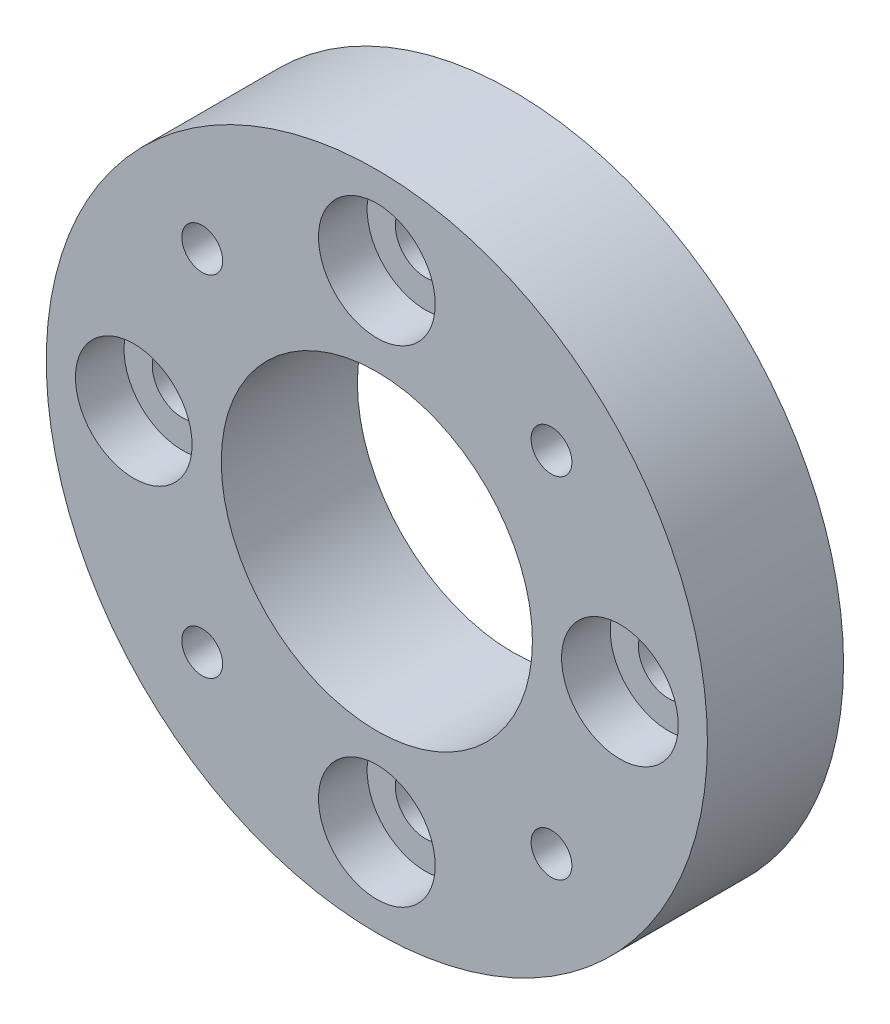
ISO-10303-21;
HEADER;
FILE_DESCRIPTION(('STEP AP214'),'2;1');
FILE_NAME('part.step','',(''),(''),'','','');
FILE_SCHEMA(('AUTOMOTIVE_DESIGN { 1 0 10303 214 1 1 1 1 }'));
ENDSEC;
DATA;
#1=APPLICATION_CONTEXT('core data for automotive mechanical design processes');
#2=APPLICATION_PROTOCOL_DEFINITION('international standard','automotive_design',2000,#1);
#3=PRODUCT_CONTEXT('',#1,'mechanical');
#4=PRODUCT('Part','Part','',(#3));
#5=PRODUCT_RELATED_PRODUCT_CATEGORY('part','',(#4));
#6=PRODUCT_DEFINITION_FORMATION('','',#4);
#7=PRODUCT_DEFINITION_CONTEXT('part definition',#1,'design');
#8=PRODUCT_DEFINITION('design','',#6,#7);
#9=PRODUCT_DEFINITION_SHAPE('','',#8);
#10=(LENGTH_UNIT() NAMED_UNIT(*) SI_UNIT(.MILLI.,.METRE.));
#11=(NAMED_UNIT(*) PLANE_ANGLE_UNIT() SI_UNIT($,.RADIAN.));
#12=(NAMED_UNIT(*) SI_UNIT($,.STERADIAN.) SOLID_ANGLE_UNIT());
#13=UNCERTAINTY_MEASURE_WITH_UNIT(LENGTH_MEASURE(1.E-05),#10,'distance_accuracy_value','');
#14=(GEOMETRIC_REPRESENTATION_CONTEXT(3) GLOBAL_UNCERTAINTY_ASSIGNED_CONTEXT((#13)) GLOBAL_UNIT_ASSIGNED_CONTEXT((#10,
#11,#12)) REPRESENTATION_CONTEXT('',''));
#15=CARTESIAN_POINT('',(0.,0.,0.));
#16=DIRECTION('',(0.,0.,1.));
#17=DIRECTION('',(1.,0.,0.));
#18=AXIS2_PLACEMENT_3D('',#15,#16,#17);
#19=CARTESIAN_POINT('',(0.,12.5,7.));
#20=DIRECTION('',(0.,0.,-1.));
#21=DIRECTION('',(-1.,0.,0.));
#22=AXIS2_PLACEMENT_3D('',#19,#20,#21);
#23=CYLINDRICAL_SURFACE('',#22,1.55);
#24=CARTESIAN_POINT('',(0.,12.5,0.));
#25=DIRECTION('',(0.,0.,1.));
#26=DIRECTION('',(1.,0.,0.));
#27=AXIS2_PLACEMENT_3D('',#24,#25,#26);
#28=CIRCLE('',#27,1.55);
#29=CARTESIAN_POINT('',(1.55,12.5,0.));
#30=VERTEX_POINT('',#29);
#31=EDGE_CURVE('E52',#30,#30,#28,.T.);
#32=ORIENTED_EDGE('',*,*,#31,.F.);
#33=EDGE_LOOP('',(#32));
#34=FACE_BOUND('',#33,.T.);
#35=CARTESIAN_POINT('',(0.,12.5,4.5));
#36=DIRECTION('',(0.,0.,1.));
#37=DIRECTION('',(1.,0.,0.));
#38=AXIS2_PLACEMENT_3D('',#35,#36,#37);
#39=CIRCLE('',#38,1.55);
#40=CARTESIAN_POINT('',(1.55,12.5,4.5));
#41=VERTEX_POINT('',#40);
#42=EDGE_CURVE('E41',#41,#41,#39,.T.);
#43=ORIENTED_EDGE('',*,*,#42,.T.);
#44=EDGE_LOOP('',(#43));
#45=FACE_BOUND('',#44,.T.);
#46=ADVANCED_FACE('F37',(#34,#45),#23,.F.);
#47=CARTESIAN_POINT('',(12.5000000000004,3.53740559381116E-13,7.));
#48=DIRECTION('',(0.,0.,-1.));
#49=DIRECTION('',(-1.,0.,0.));
#50=AXIS2_PLACEMENT_3D('',#47,#48,#49);
#51=CYLINDRICAL_SURFACE('',#50,1.55000000000028);
#52=CARTESIAN_POINT('',(12.5000000000004,3.53740559381116E-13,0.));
#53=DIRECTION('',(0.,0.,1.));
#54=DIRECTION('',(1.,0.,0.));
#55=AXIS2_PLACEMENT_3D('',#52,#53,#54);
#56=CIRCLE('',#55,1.55000000000028);
#57=CARTESIAN_POINT('',(14.0500000000006,3.53740559381116E-13,0.));
#58=VERTEX_POINT('',#57);
#59=EDGE_CURVE('E110',#58,#58,#56,.T.);
#60=ORIENTED_EDGE('',*,*,#59,.F.);
#61=EDGE_LOOP('',(#60));
#62=FACE_BOUND('',#61,.T.);
#63=CARTESIAN_POINT('',(12.5000000000004,3.53740559381116E-13,4.5));
#64=DIRECTION('',(0.,0.,1.));
#65=DIRECTION('',(1.,0.,0.));
#66=AXIS2_PLACEMENT_3D('',#63,#64,#65);
#67=CIRCLE('',#66,1.55000000000028);
#68=CARTESIAN_POINT('',(14.0500000000006,3.53740559381116E-13,4.5));
#69=VERTEX_POINT('',#68);
#70=EDGE_CURVE('E65',#69,#69,#67,.T.);
#71=ORIENTED_EDGE('',*,*,#70,.T.);
#72=EDGE_LOOP('',(#71));
#73=FACE_BOUND('',#72,.T.);
#74=ADVANCED_FACE('F148',(#62,#73),#51,.F.);
#75=CARTESIAN_POINT('',(7.07481118762232E-13,-12.5,7.));
#76=DIRECTION('',(0.,0.,-1.));
#77=DIRECTION('',(-1.,0.,0.));
#78=AXIS2_PLACEMENT_3D('',#75,#76,#77);
#79=CYLINDRICAL_SURFACE('',#78,1.55000000000076);
#80=CARTESIAN_POINT('',(7.07481118762232E-13,-12.5,0.));
#81=DIRECTION('',(0.,0.,1.));
#82=DIRECTION('',(1.,0.,0.));
#83=AXIS2_PLACEMENT_3D('',#80,#81,#82);
#84=CIRCLE('',#83,1.55000000000076);
#85=CARTESIAN_POINT('',(1.55000000000147,-12.5,0.));
#86=VERTEX_POINT('',#85);
#87=EDGE_CURVE('E106',#86,#86,#84,.T.);
#88=ORIENTED_EDGE('',*,*,#87,.F.);
#89=EDGE_LOOP('',(#88));
#90=FACE_BOUND('',#89,.T.);
#91=CARTESIAN_POINT('',(7.07481118762232E-13,-12.5,4.5));
#92=DIRECTION('',(0.,0.,1.));
#93=DIRECTION('',(1.,0.,0.));
#94=AXIS2_PLACEMENT_3D('',#91,#92,#93);
#95=CIRCLE('',#94,1.55000000000076);
#96=CARTESIAN_POINT('',(1.55000000000147,-12.5,4.5));
#97=VERTEX_POINT('',#96);
#98=EDGE_CURVE('E61',#97,#97,#95,.T.);
#99=ORIENTED_EDGE('',*,*,#98,.T.);
#100=EDGE_LOOP('',(#99));
#101=FACE_BOUND('',#100,.T.);
#102=ADVANCED_FACE('F153',(#90,#101),#79,.F.);
#103=CARTESIAN_POINT('',(-12.4999999999996,-3.5527136788005E-13,7.));
#104=DIRECTION('',(0.,0.,-1.));
#105=DIRECTION('',(-1.,0.,0.));
#106=AXIS2_PLACEMENT_3D('',#103,#104,#105);
#107=CYLINDRICAL_SURFACE('',#106,1.55000000000057);
#108=CARTESIAN_POINT('',(-12.4999999999996,-3.5527136788005E-13,0.));
#109=DIRECTION('',(0.,0.,1.));
#110=DIRECTION('',(1.,0.,0.));
#111=AXIS2_PLACEMENT_3D('',#108,#109,#110);
#112=CIRCLE('',#111,1.55000000000057);
#113=CARTESIAN_POINT('',(-10.9499999999991,-3.5527136788005E-13,0.));
#114=VERTEX_POINT('',#113);
#115=EDGE_CURVE('E99',#114,#114,#112,.T.);
#116=ORIENTED_EDGE('',*,*,#115,.F.);
#117=EDGE_LOOP('',(#116));
#118=FACE_BOUND('',#117,.T.);
#119=CARTESIAN_POINT('',(-12.4999999999996,-3.5527136788005E-13,4.5));
#120=DIRECTION('',(0.,0.,1.));
#121=DIRECTION('',(1.,0.,0.));
#122=AXIS2_PLACEMENT_3D('',#119,#120,#121);
#123=CIRCLE('',#122,1.55000000000057);
#124=CARTESIAN_POINT('',(-10.9499999999991,-3.5527136788005E-13,4.5));
#125=VERTEX_POINT('',#124);
#126=EDGE_CURVE('E57',#125,#125,#123,.T.);
#127=ORIENTED_EDGE('',*,*,#126,.T.);
#128=EDGE_LOOP('',(#127));
#129=FACE_BOUND('',#128,.T.);
#130=ADVANCED_FACE('F160',(#118,#129),#107,.F.);
#131=CARTESIAN_POINT('',(0.,0.,7.));
#132=DIRECTION('',(0.,0.,1.));
#133=DIRECTION('',(1.,0.,0.));
#134=AXIS2_PLACEMENT_3D('',#131,#132,#133);
#135=PLANE('',#134);
#136=CARTESIAN_POINT('',(0.,12.5,7.));
#137=DIRECTION('',(0.,0.,1.));
#138=DIRECTION('',(1.,0.,0.));
#139=AXIS2_PLACEMENT_3D('',#136,#137,#138);
#140=CIRCLE('',#139,3.);
#141=CARTESIAN_POINT('',(3.,12.5,7.));
#142=VERTEX_POINT('',#141);
#143=EDGE_CURVE('E336',#142,#142,#140,.T.);
#144=ORIENTED_EDGE('',*,*,#143,.F.);
#145=EDGE_LOOP('',(#144));
#146=FACE_BOUND('',#145,.T.);
#147=CARTESIAN_POINT('',(12.5000000000004,3.53740559381116E-13,7.));
#148=DIRECTION('',(0.,0.,1.));
#149=DIRECTION('',(1.,0.,0.));
#150=AXIS2_PLACEMENT_3D('',#147,#148,#149);
#151=CIRCLE('',#150,3.00000000000028);
#152=CARTESIAN_POINT('',(15.5000000000006,3.53740559381116E-13,7.));
#153=VERTEX_POINT('',#152);
#154=EDGE_CURVE('E346',#153,#153,#151,.T.);
#155=ORIENTED_EDGE('',*,*,#154,.F.);
#156=EDGE_LOOP('',(#155));
#157=FACE_BOUND('',#156,.T.);
#158=CARTESIAN_POINT('',(7.07481118762232E-13,-12.5,7.));
#159=DIRECTION('',(0.,0.,1.));
#160=DIRECTION('',(1.,0.,0.));
#161=AXIS2_PLACEMENT_3D('',#158,#159,#160);
#162=CIRCLE('',#161,3.00000000000076);
#163=CARTESIAN_POINT('',(3.00000000000147,-12.5,7.));
#164=VERTEX_POINT('',#163);
#165=EDGE_CURVE('E354',#164,#164,#162,.T.);
#166=ORIENTED_EDGE('',*,*,#165,.F.);
#167=EDGE_LOOP('',(#166));
#168=FACE_BOUND('',#167,.T.);
#169=CARTESIAN_POINT('',(-12.4999999999996,-3.5527136788005E-13,7.));
#170=DIRECTION('',(0.,0.,1.));
#171=DIRECTION('',(1.,0.,0.));
#172=AXIS2_PLACEMENT_3D('',#169,#170,#171);
#173=CIRCLE('',#172,3.00000000000057);
#174=CARTESIAN_POINT('',(-9.49999999999908,-3.5527136788005E-13,7.));
#175=VERTEX_POINT('',#174);
#176=EDGE_CURVE('E361',#175,#175,#173,.T.);
#177=ORIENTED_EDGE('',*,*,#176,.F.);
#178=EDGE_LOOP('',(#177));
#179=FACE_BOUND('',#178,.T.);
#180=CARTESIAN_POINT('',(8.98025612106971,-8.9802561210686,7.));
#181=DIRECTION('',(0.,0.,1.));
#182=DIRECTION('',(1.,0.,0.));
#183=AXIS2_PLACEMENT_3D('',#180,#181,#182);
#184=CIRCLE('',#183,1.05000000000071);
#185=CARTESIAN_POINT('',(10.0302561210704,-8.9802561210686,7.));
#186=VERTEX_POINT('',#185);
#187=EDGE_CURVE('E87',#186,#186,#184,.T.);
#188=ORIENTED_EDGE('',*,*,#187,.F.);
#189=EDGE_LOOP('',(#188));
#190=FACE_BOUND('',#189,.T.);
#191=CARTESIAN_POINT('',(-8.9802561210692,8.98025612106911,7.));
#192=DIRECTION('',(0.,0.,1.));
#193=DIRECTION('',(1.,0.,0.));
#194=AXIS2_PLACEMENT_3D('',#191,#192,#193);
#195=CIRCLE('',#194,1.05);
#196=CARTESIAN_POINT('',(-7.9302561210692,8.98025612106911,7.));
#197=VERTEX_POINT('',#196);
#198=EDGE_CURVE('E123',#197,#197,#195,.T.);
#199=ORIENTED_EDGE('',*,*,#198,.F.);
#200=EDGE_LOOP('',(#199));
#201=FACE_BOUND('',#200,.T.);
#202=CARTESIAN_POINT('',(0.,0.,7.));
#203=DIRECTION('',(0.,0.,1.));
#204=DIRECTION('',(1.,0.,0.));
#205=AXIS2_PLACEMENT_3D('',#202,#203,#204);
#206=CIRCLE('',#205,17.);
#207=CARTESIAN_POINT('',(17.,0.,7.));
#208=VERTEX_POINT('',#207);
#209=EDGE_CURVE('E10',#208,#208,#206,.T.);
#210=ORIENTED_EDGE('',*,*,#209,.T.);
#211=EDGE_LOOP('',(#210));
#212=FACE_BOUND('',#211,.T.);
#213=CARTESIAN_POINT('',(0.,0.,7.));
#214=DIRECTION('',(0.,0.,1.));
#215=DIRECTION('',(1.,0.,0.));
#216=AXIS2_PLACEMENT_3D('',#213,#214,#215);
#217=CIRCLE('',#216,8.);
#218=CARTESIAN_POINT('',(8.,0.,7.));
#219=VERTEX_POINT('',#218);
#220=EDGE_CURVE('E115',#219,#219,#217,.T.);
#221=ORIENTED_EDGE('',*,*,#220,.F.);
#222=EDGE_LOOP('',(#221));
#223=FACE_BOUND('',#222,.T.);
#224=CARTESIAN_POINT('',(8.98025612106911,8.98025612106971,7.));
#225=DIRECTION('',(0.,0.,1.));
#226=DIRECTION('',(1.,0.,0.));
#227=AXIS2_PLACEMENT_3D('',#224,#225,#226);
#228=CIRCLE('',#227,1.05000000000052);
#229=CARTESIAN_POINT('',(10.0302561210696,8.98025612106971,7.));
#230=VERTEX_POINT('',#229);
#231=EDGE_CURVE('E95',#230,#230,#228,.T.);
#232=ORIENTED_EDGE('',*,*,#231,.F.);
#233=EDGE_LOOP('',(#232));
#234=FACE_BOUND('',#233,.T.);
#235=CARTESIAN_POINT('',(-8.9802561210686,-8.9802561210692,7.));
#236=DIRECTION('',(0.,0.,1.));
#237=DIRECTION('',(1.,0.,0.));
#238=AXIS2_PLACEMENT_3D('',#235,#236,#237);
#239=CIRCLE('',#238,1.05000000000027);
#240=CARTESIAN_POINT('',(-7.93025612106833,-8.9802561210692,7.));
#241=VERTEX_POINT('',#240);
#242=EDGE_CURVE('E77',#241,#241,#239,.T.);
#243=ORIENTED_EDGE('',*,*,#242,.F.);
#244=EDGE_LOOP('',(#243));
#245=FACE_BOUND('',#244,.T.);
#246=ADVANCED_FACE('F158',(#146,#157,#168,#179,#190,#201,#212,#223,#234,#245),#135,.T.);
#247=CARTESIAN_POINT('',(0.,0.,0.));
#248=DIRECTION('',(0.,0.,1.));
#249=DIRECTION('',(1.,0.,0.));
#250=AXIS2_PLACEMENT_3D('',#247,#248,#249);
#251=PLANE('',#250);
#252=CARTESIAN_POINT('',(0.,0.,0.));
#253=DIRECTION('',(0.,0.,1.));
#254=DIRECTION('',(1.,0.,0.));
#255=AXIS2_PLACEMENT_3D('',#252,#253,#254);
#256=CIRCLE('',#255,17.);
#257=CARTESIAN_POINT('',(17.,0.,0.));
#258=VERTEX_POINT('',#257);
#259=EDGE_CURVE('E46',#258,#258,#256,.T.);
#260=ORIENTED_EDGE('',*,*,#259,.F.);
#261=EDGE_LOOP('',(#260));
#262=FACE_BOUND('',#261,.T.);
#263=ORIENTED_EDGE('',*,*,#31,.T.);
#264=EDGE_LOOP('',(#263));
#265=FACE_BOUND('',#264,.T.);
#266=CARTESIAN_POINT('',(-8.9802561210692,8.98025612106911,0.));
#267=DIRECTION('',(0.,0.,1.));
#268=DIRECTION('',(1.,0.,0.));
#269=AXIS2_PLACEMENT_3D('',#266,#267,#268);
#270=CIRCLE('',#269,1.05);
#271=CARTESIAN_POINT('',(-7.9302561210692,8.98025612106911,0.));
#272=VERTEX_POINT('',#271);
#273=EDGE_CURVE('E119',#272,#272,#270,.T.);
#274=ORIENTED_EDGE('',*,*,#273,.T.);
#275=EDGE_LOOP('',(#274));
#276=FACE_BOUND('',#275,.T.);
#277=CARTESIAN_POINT('',(0.,0.,0.));
#278=DIRECTION('',(0.,0.,1.));
#279=DIRECTION('',(1.,0.,0.));
#280=AXIS2_PLACEMENT_3D('',#277,#278,#279);
#281=CIRCLE('',#280,8.);
#282=CARTESIAN_POINT('',(8.,0.,0.));
#283=VERTEX_POINT('',#282);
#284=EDGE_CURVE('E114',#283,#283,#281,.T.);
#285=ORIENTED_EDGE('',*,*,#284,.T.);
#286=EDGE_LOOP('',(#285));
#287=FACE_BOUND('',#286,.T.);
#288=ORIENTED_EDGE('',*,*,#59,.T.);
#289=EDGE_LOOP('',(#288));
#290=FACE_BOUND('',#289,.T.);
#291=ORIENTED_EDGE('',*,*,#87,.T.);
#292=EDGE_LOOP('',(#291));
#293=FACE_BOUND('',#292,.T.);
#294=ORIENTED_EDGE('',*,*,#115,.T.);
#295=EDGE_LOOP('',(#294));
#296=FACE_BOUND('',#295,.T.);
#297=CARTESIAN_POINT('',(8.98025612106911,8.98025612106971,0.));
#298=DIRECTION('',(0.,0.,1.));
#299=DIRECTION('',(1.,0.,0.));
#300=AXIS2_PLACEMENT_3D('',#297,#298,#299);
#301=CIRCLE('',#300,1.05000000000052);
#302=CARTESIAN_POINT('',(10.0302561210696,8.98025612106971,0.));
#303=VERTEX_POINT('',#302);
#304=EDGE_CURVE('E91',#303,#303,#301,.T.);
#305=ORIENTED_EDGE('',*,*,#304,.T.);
#306=EDGE_LOOP('',(#305));
#307=FACE_BOUND('',#306,.T.);
#308=CARTESIAN_POINT('',(8.98025612106971,-8.9802561210686,0.));
#309=DIRECTION('',(0.,0.,1.));
#310=DIRECTION('',(1.,0.,0.));
#311=AXIS2_PLACEMENT_3D('',#308,#309,#310);
#312=CIRCLE('',#311,1.05000000000071);
#313=CARTESIAN_POINT('',(10.0302561210704,-8.9802561210686,0.));
#314=VERTEX_POINT('',#313);
#315=EDGE_CURVE('E83',#314,#314,#312,.T.);
#316=ORIENTED_EDGE('',*,*,#315,.T.);
#317=EDGE_LOOP('',(#316));
#318=FACE_BOUND('',#317,.T.);
#319=CARTESIAN_POINT('',(-8.9802561210686,-8.9802561210692,0.));
#320=DIRECTION('',(0.,0.,1.));
#321=DIRECTION('',(1.,0.,0.));
#322=AXIS2_PLACEMENT_3D('',#319,#320,#321);
#323=CIRCLE('',#322,1.05000000000027);
#324=CARTESIAN_POINT('',(-7.93025612106833,-8.9802561210692,0.));
#325=VERTEX_POINT('',#324);
#326=EDGE_CURVE('E72',#325,#325,#323,.T.);
#327=ORIENTED_EDGE('',*,*,#326,.T.);
#328=EDGE_LOOP('',(#327));
#329=FACE_BOUND('',#328,.T.);
#330=ADVANCED_FACE('F130',(#262,#265,#276,#287,#290,#293,#296,#307,#318,#329),#251,.F.);
#331=CARTESIAN_POINT('',(0.,0.,7.));
#332=DIRECTION('',(0.,0.,-1.));
#333=DIRECTION('',(-1.,0.,0.));
#334=AXIS2_PLACEMENT_3D('',#331,#332,#333);
#335=CYLINDRICAL_SURFACE('',#334,17.);
#336=ORIENTED_EDGE('',*,*,#209,.F.);
#337=EDGE_LOOP('',(#336));
#338=FACE_BOUND('',#337,.T.);
#339=ORIENTED_EDGE('',*,*,#259,.T.);
#340=EDGE_LOOP('',(#339));
#341=FACE_BOUND('',#340,.T.);
#342=ADVANCED_FACE('F39',(#338,#341),#335,.T.);
#343=CARTESIAN_POINT('',(-8.9802561210692,8.98025612106911,7.));
#344=DIRECTION('',(0.,0.,-1.));
#345=DIRECTION('',(-1.,0.,0.));
#346=AXIS2_PLACEMENT_3D('',#343,#344,#345);
#347=CYLINDRICAL_SURFACE('',#346,1.05);
#348=ORIENTED_EDGE('',*,*,#198,.T.);
#349=EDGE_LOOP('',(#348));
#350=FACE_BOUND('',#349,.T.);
#351=ORIENTED_EDGE('',*,*,#273,.F.);
#352=EDGE_LOOP('',(#351));
#353=FACE_BOUND('',#352,.T.);
#354=ADVANCED_FACE('F133',(#350,#353),#347,.F.);
#355=CARTESIAN_POINT('',(0.,0.,7.));
#356=DIRECTION('',(0.,0.,-1.));
#357=DIRECTION('',(-1.,0.,0.));
#358=AXIS2_PLACEMENT_3D('',#355,#356,#357);
#359=CYLINDRICAL_SURFACE('',#358,8.);
#360=ORIENTED_EDGE('',*,*,#220,.T.);
#361=EDGE_LOOP('',(#360));
#362=FACE_BOUND('',#361,.T.);
#363=ORIENTED_EDGE('',*,*,#284,.F.);
#364=EDGE_LOOP('',(#363));
#365=FACE_BOUND('',#364,.T.);
#366=ADVANCED_FACE('F135',(#362,#365),#359,.F.);
#367=CARTESIAN_POINT('',(8.98025612106911,8.98025612106971,7.));
#368=DIRECTION('',(0.,0.,-1.));
#369=DIRECTION('',(-1.,0.,0.));
#370=AXIS2_PLACEMENT_3D('',#367,#368,#369);
#371=CYLINDRICAL_SURFACE('',#370,1.05000000000052);
#372=ORIENTED_EDGE('',*,*,#231,.T.);
#373=EDGE_LOOP('',(#372));
#374=FACE_BOUND('',#373,.T.);
#375=ORIENTED_EDGE('',*,*,#304,.F.);
#376=EDGE_LOOP('',(#375));
#377=FACE_BOUND('',#376,.T.);
#378=ADVANCED_FACE('F142',(#374,#377),#371,.F.);
#379=CARTESIAN_POINT('',(8.98025612106971,-8.9802561210686,7.));
#380=DIRECTION('',(0.,0.,-1.));
#381=DIRECTION('',(-1.,0.,0.));
#382=AXIS2_PLACEMENT_3D('',#379,#380,#381);
#383=CYLINDRICAL_SURFACE('',#382,1.05000000000071);
#384=ORIENTED_EDGE('',*,*,#187,.T.);
#385=EDGE_LOOP('',(#384));
#386=FACE_BOUND('',#385,.T.);
#387=ORIENTED_EDGE('',*,*,#315,.F.);
#388=EDGE_LOOP('',(#387));
#389=FACE_BOUND('',#388,.T.);
#390=ADVANCED_FACE('F197',(#386,#389),#383,.F.);
#391=CARTESIAN_POINT('',(-8.9802561210686,-8.9802561210692,7.));
#392=DIRECTION('',(0.,0.,-1.));
#393=DIRECTION('',(-1.,0.,0.));
#394=AXIS2_PLACEMENT_3D('',#391,#392,#393);
#395=CYLINDRICAL_SURFACE('',#394,1.05000000000027);
#396=ORIENTED_EDGE('',*,*,#242,.T.);
#397=EDGE_LOOP('',(#396));
#398=FACE_BOUND('',#397,.T.);
#399=ORIENTED_EDGE('',*,*,#326,.F.);
#400=EDGE_LOOP('',(#399));
#401=FACE_BOUND('',#400,.T.);
#402=ADVANCED_FACE('F207',(#398,#401),#395,.F.);
#403=CARTESIAN_POINT('',(-12.4999999999996,-3.5527136788005E-13,4.5));
#404=DIRECTION('',(0.,0.,1.));
#405=DIRECTION('',(1.,0.,0.));
#406=AXIS2_PLACEMENT_3D('',#403,#404,#405);
#407=CYLINDRICAL_SURFACE('',#406,3.00000000000057);
#408=CARTESIAN_POINT('',(-12.4999999999996,-3.5527136788005E-13,4.5));
#409=DIRECTION('',(0.,0.,1.));
#410=DIRECTION('',(1.,0.,0.));
#411=AXIS2_PLACEMENT_3D('',#408,#409,#410);
#412=CIRCLE('',#411,3.00000000000057);
#413=CARTESIAN_POINT('',(-9.49999999999908,-3.5527136788005E-13,4.5));
#414=VERTEX_POINT('',#413);
#415=EDGE_CURVE('E358',#414,#414,#412,.T.);
#416=ORIENTED_EDGE('',*,*,#415,.F.);
#417=EDGE_LOOP('',(#416));
#418=FACE_BOUND('',#417,.T.);
#419=ORIENTED_EDGE('',*,*,#176,.T.);
#420=EDGE_LOOP('',(#419));
#421=FACE_BOUND('',#420,.T.);
#422=ADVANCED_FACE('F216',(#418,#421),#407,.F.);
#423=CARTESIAN_POINT('',(-12.4999999999996,-3.5527136788005E-13,4.5));
#424=DIRECTION('',(0.,0.,1.));
#425=DIRECTION('',(1.,0.,0.));
#426=AXIS2_PLACEMENT_3D('',#423,#424,#425);
#427=PLANE('',#426);
#428=ORIENTED_EDGE('',*,*,#126,.F.);
#429=EDGE_LOOP('',(#428));
#430=FACE_BOUND('',#429,.T.);
#431=ORIENTED_EDGE('',*,*,#415,.T.);
#432=EDGE_LOOP('',(#431));
#433=FACE_BOUND('',#432,.T.);
#434=ADVANCED_FACE('F258',(#430,#433),#427,.T.);
#435=CARTESIAN_POINT('',(7.07481118762232E-13,-12.5,4.5));
#436=DIRECTION('',(0.,0.,1.));
#437=DIRECTION('',(1.,0.,0.));
#438=AXIS2_PLACEMENT_3D('',#435,#436,#437);
#439=CYLINDRICAL_SURFACE('',#438,3.00000000000076);
#440=CARTESIAN_POINT('',(7.07481118762232E-13,-12.5,4.5));
#441=DIRECTION('',(0.,0.,1.));
#442=DIRECTION('',(1.,0.,0.));
#443=AXIS2_PLACEMENT_3D('',#440,#441,#442);
#444=CIRCLE('',#443,3.00000000000076);
#445=CARTESIAN_POINT('',(3.00000000000147,-12.5,4.5));
#446=VERTEX_POINT('',#445);
#447=EDGE_CURVE('E350',#446,#446,#444,.T.);
#448=ORIENTED_EDGE('',*,*,#447,.F.);
#449=EDGE_LOOP('',(#448));
#450=FACE_BOUND('',#449,.T.);
#451=ORIENTED_EDGE('',*,*,#165,.T.);
#452=EDGE_LOOP('',(#451));
#453=FACE_BOUND('',#452,.T.);
#454=ADVANCED_FACE('F268',(#450,#453),#439,.F.);
#455=CARTESIAN_POINT('',(7.07481118762232E-13,-12.5,4.5));
#456=DIRECTION('',(0.,0.,1.));
#457=DIRECTION('',(1.,0.,0.));
#458=AXIS2_PLACEMENT_3D('',#455,#456,#457);
#459=PLANE('',#458);
#460=ORIENTED_EDGE('',*,*,#98,.F.);
#461=EDGE_LOOP('',(#460));
#462=FACE_BOUND('',#461,.T.);
#463=ORIENTED_EDGE('',*,*,#447,.T.);
#464=EDGE_LOOP('',(#463));
#465=FACE_BOUND('',#464,.T.);
#466=ADVANCED_FACE('F278',(#462,#465),#459,.T.);
#467=CARTESIAN_POINT('',(12.5000000000004,3.53740559381116E-13,4.5));
#468=DIRECTION('',(0.,0.,1.));
#469=DIRECTION('',(1.,0.,0.));
#470=AXIS2_PLACEMENT_3D('',#467,#468,#469);
#471=CYLINDRICAL_SURFACE('',#470,3.00000000000028);
#472=CARTESIAN_POINT('',(12.5000000000004,3.53740559381116E-13,4.5));
#473=DIRECTION('',(0.,0.,1.));
#474=DIRECTION('',(1.,0.,0.));
#475=AXIS2_PLACEMENT_3D('',#472,#473,#474);
#476=CIRCLE('',#475,3.00000000000028);
#477=CARTESIAN_POINT('',(15.5000000000006,3.53740559381116E-13,4.5));
#478=VERTEX_POINT('',#477);
#479=EDGE_CURVE('E340',#478,#478,#476,.T.);
#480=ORIENTED_EDGE('',*,*,#479,.F.);
#481=EDGE_LOOP('',(#480));
#482=FACE_BOUND('',#481,.T.);
#483=ORIENTED_EDGE('',*,*,#154,.T.);
#484=EDGE_LOOP('',(#483));
#485=FACE_BOUND('',#484,.T.);
#486=ADVANCED_FACE('F288',(#482,#485),#471,.F.);
#487=CARTESIAN_POINT('',(12.5000000000004,3.53740559381116E-13,4.5));
#488=DIRECTION('',(0.,0.,1.));
#489=DIRECTION('',(1.,0.,0.));
#490=AXIS2_PLACEMENT_3D('',#487,#488,#489);
#491=PLANE('',#490);
#492=ORIENTED_EDGE('',*,*,#70,.F.);
#493=EDGE_LOOP('',(#492));
#494=FACE_BOUND('',#493,.T.);
#495=ORIENTED_EDGE('',*,*,#479,.T.);
#496=EDGE_LOOP('',(#495));
#497=FACE_BOUND('',#496,.T.);
#498=ADVANCED_FACE('F298',(#494,#497),#491,.T.);
#499=CARTESIAN_POINT('',(0.,12.5,4.5));
#500=DIRECTION('',(0.,0.,1.));
#501=DIRECTION('',(1.,0.,0.));
#502=AXIS2_PLACEMENT_3D('',#499,#500,#501);
#503=CYLINDRICAL_SURFACE('',#502,3.);
#504=CARTESIAN_POINT('',(0.,12.5,4.5));
#505=DIRECTION('',(0.,0.,1.));
#506=DIRECTION('',(1.,0.,0.));
#507=AXIS2_PLACEMENT_3D('',#504,#505,#506);
#508=CIRCLE('',#507,3.);
#509=CARTESIAN_POINT('',(3.,12.5,4.5));
#510=VERTEX_POINT('',#509);
#511=EDGE_CURVE('E62',#510,#510,#508,.T.);
#512=ORIENTED_EDGE('',*,*,#511,.F.);
#513=EDGE_LOOP('',(#512));
#514=FACE_BOUND('',#513,.T.);
#515=ORIENTED_EDGE('',*,*,#143,.T.);
#516=EDGE_LOOP('',(#515));
#517=FACE_BOUND('',#516,.T.);
#518=ADVANCED_FACE('F308',(#514,#517),#503,.F.);
#519=CARTESIAN_POINT('',(0.,12.5,4.5));
#520=DIRECTION('',(0.,0.,1.));
#521=DIRECTION('',(1.,0.,0.));
#522=AXIS2_PLACEMENT_3D('',#519,#520,#521);
#523=PLANE('',#522);
#524=ORIENTED_EDGE('',*,*,#42,.F.);
#525=EDGE_LOOP('',(#524));
#526=FACE_BOUND('',#525,.T.);
#527=ORIENTED_EDGE('',*,*,#511,.T.);
#528=EDGE_LOOP('',(#527));
#529=FACE_BOUND('',#528,.T.);
#530=ADVANCED_FACE('F318',(#526,#529),#523,.T.);
#531=CLOSED_SHELL('',(#46,#74,#102,#130,#246,#330,#342,#354,#366,#378,#390,#402,#422,#434,#454,
#466,#486,#498,#518,#530));
#532=MANIFOLD_SOLID_BREP('B2',#531);
#533=ADVANCED_BREP_SHAPE_REPRESENTATION('',(#18,#532),#14);
#534=SHAPE_DEFINITION_REPRESENTATION(#9,#533);
ENDSEC;
END-ISO-10303-21;
